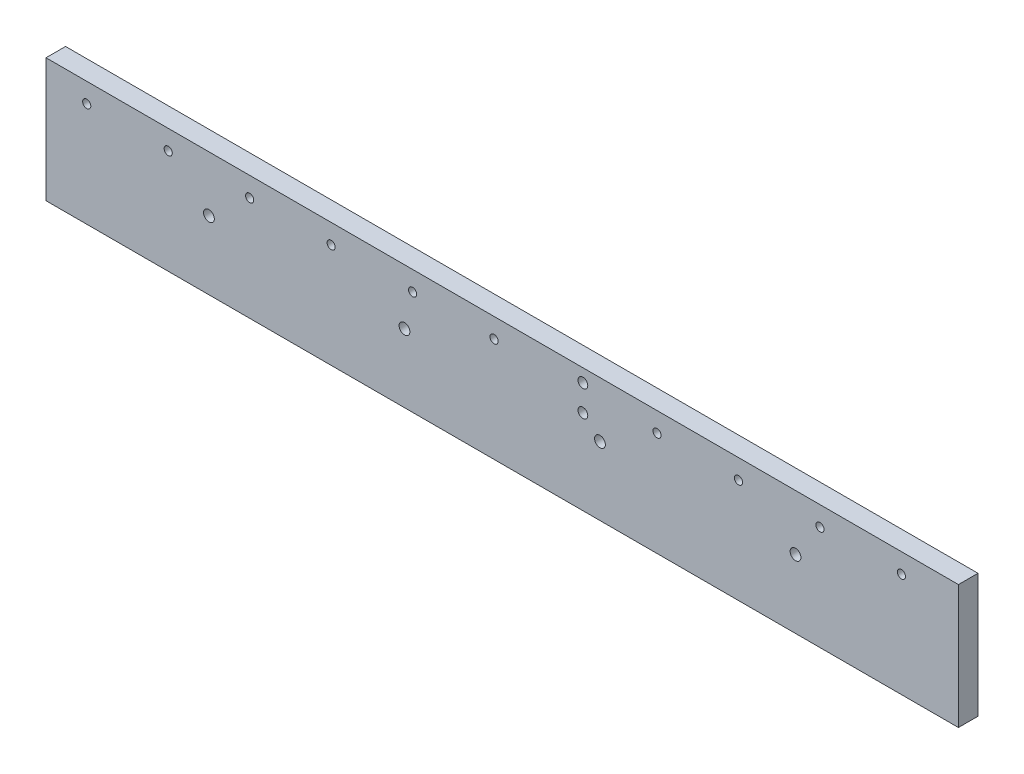
ISO-10303-21;
HEADER;
FILE_DESCRIPTION(('STEP AP214'),'2;1');
FILE_NAME('part.step','',(''),(''),'','','');
FILE_SCHEMA(('AUTOMOTIVE_DESIGN { 1 0 10303 214 1 1 1 1 }'));
ENDSEC;
DATA;
#1=APPLICATION_CONTEXT('core data for automotive mechanical design processes');
#2=APPLICATION_PROTOCOL_DEFINITION('international standard','automotive_design',2000,#1);
#3=PRODUCT_CONTEXT('',#1,'mechanical');
#4=PRODUCT('Part','Part','',(#3));
#5=PRODUCT_RELATED_PRODUCT_CATEGORY('part','',(#4));
#6=PRODUCT_DEFINITION_FORMATION('','',#4);
#7=PRODUCT_DEFINITION_CONTEXT('part definition',#1,'design');
#8=PRODUCT_DEFINITION('design','',#6,#7);
#9=PRODUCT_DEFINITION_SHAPE('','',#8);
#10=(LENGTH_UNIT() NAMED_UNIT(*) SI_UNIT(.MILLI.,.METRE.));
#11=(NAMED_UNIT(*) PLANE_ANGLE_UNIT() SI_UNIT($,.RADIAN.));
#12=(NAMED_UNIT(*) SI_UNIT($,.STERADIAN.) SOLID_ANGLE_UNIT());
#13=UNCERTAINTY_MEASURE_WITH_UNIT(LENGTH_MEASURE(1.E-05),#10,'distance_accuracy_value','');
#14=(GEOMETRIC_REPRESENTATION_CONTEXT(3) GLOBAL_UNCERTAINTY_ASSIGNED_CONTEXT((#13)) GLOBAL_UNIT_ASSIGNED_CONTEXT((#10,
#11,#12)) REPRESENTATION_CONTEXT('',''));
#15=CARTESIAN_POINT('',(0.,0.,0.));
#16=DIRECTION('',(0.,0.,1.));
#17=DIRECTION('',(1.,0.,0.));
#18=AXIS2_PLACEMENT_3D('',#15,#16,#17);
#19=CARTESIAN_POINT('',(0.,0.,6.));
#20=DIRECTION('',(1.,0.,0.));
#21=DIRECTION('',(0.,0.,-1.));
#22=AXIS2_PLACEMENT_3D('',#19,#20,#21);
#23=PLANE('',#22);
#24=DIRECTION('',(0.,-1.,0.));
#25=VECTOR('',#24,1.);
#26=CARTESIAN_POINT('',(0.,0.,0.));
#27=LINE('',#26,#25);
#28=CARTESIAN_POINT('',(0.,38.,0.));
#29=VERTEX_POINT('',#28);
#30=CARTESIAN_POINT('',(0.,0.,0.));
#31=VERTEX_POINT('',#30);
#32=EDGE_CURVE('E95',#29,#31,#27,.T.);
#33=ORIENTED_EDGE('',*,*,#32,.T.);
#34=DIRECTION('',(0.,0.,-1.));
#35=VECTOR('',#34,1.);
#36=CARTESIAN_POINT('',(0.,0.,6.));
#37=LINE('',#36,#35);
#38=CARTESIAN_POINT('',(0.,0.,6.));
#39=VERTEX_POINT('',#38);
#40=EDGE_CURVE('E11',#39,#31,#37,.T.);
#41=ORIENTED_EDGE('',*,*,#40,.F.);
#42=DIRECTION('',(0.,-1.,0.));
#43=VECTOR('',#42,1.);
#44=CARTESIAN_POINT('',(0.,0.,6.));
#45=LINE('',#44,#43);
#46=CARTESIAN_POINT('',(0.,38.,6.));
#47=VERTEX_POINT('',#46);
#48=EDGE_CURVE('E83',#47,#39,#45,.T.);
#49=ORIENTED_EDGE('',*,*,#48,.F.);
#50=DIRECTION('',(0.,0.,-1.));
#51=VECTOR('',#50,1.);
#52=CARTESIAN_POINT('',(0.,38.,6.));
#53=LINE('',#52,#51);
#54=EDGE_CURVE('E91',#47,#29,#53,.T.);
#55=ORIENTED_EDGE('',*,*,#54,.T.);
#56=EDGE_LOOP('',(#33,#41,#49,#55));
#57=FACE_BOUND('',#56,.T.);
#58=ADVANCED_FACE('F32',(#57),#23,.F.);
#59=CARTESIAN_POINT('',(0.,0.,6.));
#60=DIRECTION('',(0.,1.,0.));
#61=DIRECTION('',(0.,0.,1.));
#62=AXIS2_PLACEMENT_3D('',#59,#60,#61);
#63=PLANE('',#62);
#64=DIRECTION('',(1.,0.,0.));
#65=VECTOR('',#64,1.);
#66=CARTESIAN_POINT('',(0.,0.,0.));
#67=LINE('',#66,#65);
#68=CARTESIAN_POINT('',(280.,0.,0.));
#69=VERTEX_POINT('',#68);
#70=EDGE_CURVE('E87',#31,#69,#67,.T.);
#71=ORIENTED_EDGE('',*,*,#70,.T.);
#72=DIRECTION('',(0.,0.,-1.));
#73=VECTOR('',#72,1.);
#74=CARTESIAN_POINT('',(280.,0.,6.));
#75=LINE('',#74,#73);
#76=CARTESIAN_POINT('',(280.,0.,6.));
#77=VERTEX_POINT('',#76);
#78=EDGE_CURVE('E40',#77,#69,#75,.T.);
#79=ORIENTED_EDGE('',*,*,#78,.F.);
#80=DIRECTION('',(1.,0.,0.));
#81=VECTOR('',#80,1.);
#82=CARTESIAN_POINT('',(0.,0.,6.));
#83=LINE('',#82,#81);
#84=EDGE_CURVE('E78',#39,#77,#83,.T.);
#85=ORIENTED_EDGE('',*,*,#84,.F.);
#86=ORIENTED_EDGE('',*,*,#40,.T.);
#87=EDGE_LOOP('',(#71,#79,#85,#86));
#88=FACE_BOUND('',#87,.T.);
#89=ADVANCED_FACE('F86',(#88),#63,.F.);
#90=CARTESIAN_POINT('',(280.,0.,6.));
#91=DIRECTION('',(-1.,0.,0.));
#92=DIRECTION('',(0.,0.,1.));
#93=AXIS2_PLACEMENT_3D('',#90,#91,#92);
#94=PLANE('',#93);
#95=DIRECTION('',(0.,1.,0.));
#96=VECTOR('',#95,1.);
#97=CARTESIAN_POINT('',(280.,0.,0.));
#98=LINE('',#97,#96);
#99=CARTESIAN_POINT('',(280.,38.,0.));
#100=VERTEX_POINT('',#99);
#101=EDGE_CURVE('E65',#69,#100,#98,.T.);
#102=ORIENTED_EDGE('',*,*,#101,.T.);
#103=DIRECTION('',(0.,0.,-1.));
#104=VECTOR('',#103,1.);
#105=CARTESIAN_POINT('',(280.,38.,6.));
#106=LINE('',#105,#104);
#107=CARTESIAN_POINT('',(280.,38.,6.));
#108=VERTEX_POINT('',#107);
#109=EDGE_CURVE('E88',#108,#100,#106,.T.);
#110=ORIENTED_EDGE('',*,*,#109,.F.);
#111=DIRECTION('',(0.,1.,0.));
#112=VECTOR('',#111,1.);
#113=CARTESIAN_POINT('',(280.,0.,6.));
#114=LINE('',#113,#112);
#115=EDGE_CURVE('E81',#77,#108,#114,.T.);
#116=ORIENTED_EDGE('',*,*,#115,.F.);
#117=ORIENTED_EDGE('',*,*,#78,.T.);
#118=EDGE_LOOP('',(#102,#110,#116,#117));
#119=FACE_BOUND('',#118,.T.);
#120=ADVANCED_FACE('F89',(#119),#94,.F.);
#121=CARTESIAN_POINT('',(0.,38.,6.));
#122=DIRECTION('',(0.,-1.,0.));
#123=DIRECTION('',(0.,0.,-1.));
#124=AXIS2_PLACEMENT_3D('',#121,#122,#123);
#125=PLANE('',#124);
#126=DIRECTION('',(-1.,0.,0.));
#127=VECTOR('',#126,1.);
#128=CARTESIAN_POINT('',(0.,38.,0.));
#129=LINE('',#128,#127);
#130=EDGE_CURVE('E71',#100,#29,#129,.T.);
#131=ORIENTED_EDGE('',*,*,#130,.T.);
#132=ORIENTED_EDGE('',*,*,#54,.F.);
#133=DIRECTION('',(-1.,0.,0.));
#134=VECTOR('',#133,1.);
#135=CARTESIAN_POINT('',(0.,38.,6.));
#136=LINE('',#135,#134);
#137=EDGE_CURVE('E48',#108,#47,#136,.T.);
#138=ORIENTED_EDGE('',*,*,#137,.F.);
#139=ORIENTED_EDGE('',*,*,#109,.T.);
#140=EDGE_LOOP('',(#131,#132,#138,#139));
#141=FACE_BOUND('',#140,.T.);
#142=ADVANCED_FACE('F103',(#141),#125,.F.);
#143=CARTESIAN_POINT('',(0.,0.,6.));
#144=DIRECTION('',(0.,0.,-1.));
#145=DIRECTION('',(-1.,0.,0.));
#146=AXIS2_PLACEMENT_3D('',#143,#144,#145);
#147=PLANE('',#146);
#148=CARTESIAN_POINT('',(164.75,26.,6.));
#149=DIRECTION('',(0.,0.,-1.));
#150=DIRECTION('',(-1.,0.,0.));
#151=AXIS2_PLACEMENT_3D('',#148,#149,#150);
#152=CIRCLE('',#151,1.5);
#153=CARTESIAN_POINT('',(163.25,26.,6.));
#154=VERTEX_POINT('',#153);
#155=EDGE_CURVE('E198',#154,#154,#152,.T.);
#156=ORIENTED_EDGE('',*,*,#155,.T.);
#157=EDGE_LOOP('',(#156));
#158=FACE_BOUND('',#157,.T.);
#159=CARTESIAN_POINT('',(164.75,34.,6.));
#160=DIRECTION('',(0.,0.,-1.));
#161=DIRECTION('',(-1.,0.,0.));
#162=AXIS2_PLACEMENT_3D('',#159,#160,#161);
#163=CIRCLE('',#162,1.5);
#164=CARTESIAN_POINT('',(163.25,34.,6.));
#165=VERTEX_POINT('',#164);
#166=EDGE_CURVE('E188',#165,#165,#163,.T.);
#167=ORIENTED_EDGE('',*,*,#166,.T.);
#168=EDGE_LOOP('',(#167));
#169=FACE_BOUND('',#168,.T.);
#170=CARTESIAN_POINT('',(110.,21.,6.));
#171=DIRECTION('',(0.,0.,-1.));
#172=DIRECTION('',(-1.,0.,0.));
#173=AXIS2_PLACEMENT_3D('',#170,#171,#172);
#174=CIRCLE('',#173,1.65);
#175=CARTESIAN_POINT('',(108.35,21.,6.));
#176=VERTEX_POINT('',#175);
#177=EDGE_CURVE('E174',#176,#176,#174,.T.);
#178=ORIENTED_EDGE('',*,*,#177,.T.);
#179=EDGE_LOOP('',(#178));
#180=FACE_BOUND('',#179,.T.);
#181=CARTESIAN_POINT('',(170.,21.,6.));
#182=DIRECTION('',(0.,0.,-1.));
#183=DIRECTION('',(-1.,0.,0.));
#184=AXIS2_PLACEMENT_3D('',#181,#182,#183);
#185=CIRCLE('',#184,1.65000000000002);
#186=CARTESIAN_POINT('',(168.35,21.,6.));
#187=VERTEX_POINT('',#186);
#188=EDGE_CURVE('E177',#187,#187,#185,.T.);
#189=ORIENTED_EDGE('',*,*,#188,.T.);
#190=EDGE_LOOP('',(#189));
#191=FACE_BOUND('',#190,.T.);
#192=CARTESIAN_POINT('',(230.,21.,6.));
#193=DIRECTION('',(0.,0.,-1.));
#194=DIRECTION('',(-1.,0.,0.));
#195=AXIS2_PLACEMENT_3D('',#192,#193,#194);
#196=CIRCLE('',#195,1.65000000000002);
#197=CARTESIAN_POINT('',(228.35,21.,6.));
#198=VERTEX_POINT('',#197);
#199=EDGE_CURVE('E180',#198,#198,#196,.T.);
#200=ORIENTED_EDGE('',*,*,#199,.T.);
#201=EDGE_LOOP('',(#200));
#202=FACE_BOUND('',#201,.T.);
#203=CARTESIAN_POINT('',(50.,21.,6.));
#204=DIRECTION('',(0.,0.,-1.));
#205=DIRECTION('',(-1.,0.,0.));
#206=AXIS2_PLACEMENT_3D('',#203,#204,#205);
#207=CIRCLE('',#206,1.65);
#208=CARTESIAN_POINT('',(48.35,21.,6.));
#209=VERTEX_POINT('',#208);
#210=EDGE_CURVE('E119',#209,#209,#207,.T.);
#211=ORIENTED_EDGE('',*,*,#210,.T.);
#212=EDGE_LOOP('',(#211));
#213=FACE_BOUND('',#212,.T.);
#214=CARTESIAN_POINT('',(37.5,32.,6.));
#215=DIRECTION('',(0.,0.,1.));
#216=DIRECTION('',(1.,0.,0.));
#217=AXIS2_PLACEMENT_3D('',#214,#215,#216);
#218=CIRCLE('',#217,1.25);
#219=CARTESIAN_POINT('',(38.75,32.,6.));
#220=VERTEX_POINT('',#219);
#221=EDGE_CURVE('E164',#220,#220,#218,.T.);
#222=ORIENTED_EDGE('',*,*,#221,.F.);
#223=EDGE_LOOP('',(#222));
#224=FACE_BOUND('',#223,.T.);
#225=CARTESIAN_POINT('',(62.5,32.,6.));
#226=DIRECTION('',(0.,0.,1.));
#227=DIRECTION('',(1.,0.,0.));
#228=AXIS2_PLACEMENT_3D('',#225,#226,#227);
#229=CIRCLE('',#228,1.25000000000001);
#230=CARTESIAN_POINT('',(63.75,32.,6.));
#231=VERTEX_POINT('',#230);
#232=EDGE_CURVE('E158',#231,#231,#229,.T.);
#233=ORIENTED_EDGE('',*,*,#232,.F.);
#234=EDGE_LOOP('',(#233));
#235=FACE_BOUND('',#234,.T.);
#236=CARTESIAN_POINT('',(87.5,32.,6.));
#237=DIRECTION('',(0.,0.,1.));
#238=DIRECTION('',(1.,0.,0.));
#239=AXIS2_PLACEMENT_3D('',#236,#237,#238);
#240=CIRCLE('',#239,1.25);
#241=CARTESIAN_POINT('',(88.75,32.,6.));
#242=VERTEX_POINT('',#241);
#243=EDGE_CURVE('E152',#242,#242,#240,.T.);
#244=ORIENTED_EDGE('',*,*,#243,.F.);
#245=EDGE_LOOP('',(#244));
#246=FACE_BOUND('',#245,.T.);
#247=CARTESIAN_POINT('',(112.5,32.,6.));
#248=DIRECTION('',(0.,0.,1.));
#249=DIRECTION('',(1.,0.,0.));
#250=AXIS2_PLACEMENT_3D('',#247,#248,#249);
#251=CIRCLE('',#250,1.25);
#252=CARTESIAN_POINT('',(113.75,32.,6.));
#253=VERTEX_POINT('',#252);
#254=EDGE_CURVE('E146',#253,#253,#251,.T.);
#255=ORIENTED_EDGE('',*,*,#254,.F.);
#256=EDGE_LOOP('',(#255));
#257=FACE_BOUND('',#256,.T.);
#258=CARTESIAN_POINT('',(137.5,32.,6.));
#259=DIRECTION('',(0.,0.,1.));
#260=DIRECTION('',(1.,0.,0.));
#261=AXIS2_PLACEMENT_3D('',#258,#259,#260);
#262=CIRCLE('',#261,1.24999999999998);
#263=CARTESIAN_POINT('',(138.75,32.,6.));
#264=VERTEX_POINT('',#263);
#265=EDGE_CURVE('E140',#264,#264,#262,.T.);
#266=ORIENTED_EDGE('',*,*,#265,.F.);
#267=EDGE_LOOP('',(#266));
#268=FACE_BOUND('',#267,.T.);
#269=CARTESIAN_POINT('',(187.5,32.,6.));
#270=DIRECTION('',(0.,0.,1.));
#271=DIRECTION('',(1.,0.,0.));
#272=AXIS2_PLACEMENT_3D('',#269,#270,#271);
#273=CIRCLE('',#272,1.24999999999998);
#274=CARTESIAN_POINT('',(188.75,32.,6.));
#275=VERTEX_POINT('',#274);
#276=EDGE_CURVE('E134',#275,#275,#273,.T.);
#277=ORIENTED_EDGE('',*,*,#276,.F.);
#278=EDGE_LOOP('',(#277));
#279=FACE_BOUND('',#278,.T.);
#280=CARTESIAN_POINT('',(212.5,32.,6.));
#281=DIRECTION('',(0.,0.,1.));
#282=DIRECTION('',(1.,0.,0.));
#283=AXIS2_PLACEMENT_3D('',#280,#281,#282);
#284=CIRCLE('',#283,1.24999999999998);
#285=CARTESIAN_POINT('',(213.75,32.,6.));
#286=VERTEX_POINT('',#285);
#287=EDGE_CURVE('E128',#286,#286,#284,.T.);
#288=ORIENTED_EDGE('',*,*,#287,.F.);
#289=EDGE_LOOP('',(#288));
#290=FACE_BOUND('',#289,.T.);
#291=CARTESIAN_POINT('',(237.5,32.,6.));
#292=DIRECTION('',(0.,0.,1.));
#293=DIRECTION('',(1.,0.,0.));
#294=AXIS2_PLACEMENT_3D('',#291,#292,#293);
#295=CIRCLE('',#294,1.24999999999998);
#296=CARTESIAN_POINT('',(238.75,32.,6.));
#297=VERTEX_POINT('',#296);
#298=EDGE_CURVE('E122',#297,#297,#295,.T.);
#299=ORIENTED_EDGE('',*,*,#298,.F.);
#300=EDGE_LOOP('',(#299));
#301=FACE_BOUND('',#300,.T.);
#302=CARTESIAN_POINT('',(262.5,32.,6.));
#303=DIRECTION('',(0.,0.,1.));
#304=DIRECTION('',(1.,0.,0.));
#305=AXIS2_PLACEMENT_3D('',#302,#303,#304);
#306=CIRCLE('',#305,1.25000000000001);
#307=CARTESIAN_POINT('',(263.75,32.,6.));
#308=VERTEX_POINT('',#307);
#309=EDGE_CURVE('E115',#308,#308,#306,.T.);
#310=ORIENTED_EDGE('',*,*,#309,.F.);
#311=EDGE_LOOP('',(#310));
#312=FACE_BOUND('',#311,.T.);
#313=CARTESIAN_POINT('',(12.5,32.,6.));
#314=DIRECTION('',(0.,0.,1.));
#315=DIRECTION('',(1.,0.,0.));
#316=AXIS2_PLACEMENT_3D('',#313,#314,#315);
#317=CIRCLE('',#316,1.25);
#318=CARTESIAN_POINT('',(13.75,32.,6.));
#319=VERTEX_POINT('',#318);
#320=EDGE_CURVE('E109',#319,#319,#317,.T.);
#321=ORIENTED_EDGE('',*,*,#320,.F.);
#322=EDGE_LOOP('',(#321));
#323=FACE_BOUND('',#322,.T.);
#324=ORIENTED_EDGE('',*,*,#48,.T.);
#325=ORIENTED_EDGE('',*,*,#84,.T.);
#326=ORIENTED_EDGE('',*,*,#115,.T.);
#327=ORIENTED_EDGE('',*,*,#137,.T.);
#328=EDGE_LOOP('',(#324,#325,#326,#327));
#329=FACE_BOUND('',#328,.T.);
#330=ADVANCED_FACE('F79',(#158,#169,#180,#191,#202,#213,#224,#235,#246,#257,#268,#279,#290,#301,
#312,#323,#329),#147,.F.);
#331=CARTESIAN_POINT('',(0.,0.,0.));
#332=DIRECTION('',(0.,0.,-1.));
#333=DIRECTION('',(-1.,0.,0.));
#334=AXIS2_PLACEMENT_3D('',#331,#332,#333);
#335=PLANE('',#334);
#336=CARTESIAN_POINT('',(164.75,26.,0.));
#337=DIRECTION('',(0.,0.,1.));
#338=DIRECTION('',(1.,0.,0.));
#339=AXIS2_PLACEMENT_3D('',#336,#337,#338);
#340=CIRCLE('',#339,1.5);
#341=CARTESIAN_POINT('',(166.25,26.,0.));
#342=VERTEX_POINT('',#341);
#343=EDGE_CURVE('E201',#342,#342,#340,.T.);
#344=ORIENTED_EDGE('',*,*,#343,.T.);
#345=EDGE_LOOP('',(#344));
#346=FACE_BOUND('',#345,.T.);
#347=CARTESIAN_POINT('',(164.75,34.,0.));
#348=DIRECTION('',(0.,0.,1.));
#349=DIRECTION('',(1.,0.,0.));
#350=AXIS2_PLACEMENT_3D('',#347,#348,#349);
#351=CIRCLE('',#350,1.5);
#352=CARTESIAN_POINT('',(166.25,34.,0.));
#353=VERTEX_POINT('',#352);
#354=EDGE_CURVE('E195',#353,#353,#351,.T.);
#355=ORIENTED_EDGE('',*,*,#354,.T.);
#356=EDGE_LOOP('',(#355));
#357=FACE_BOUND('',#356,.T.);
#358=CARTESIAN_POINT('',(110.,21.,0.));
#359=DIRECTION('',(0.,0.,1.));
#360=DIRECTION('',(1.,0.,0.));
#361=AXIS2_PLACEMENT_3D('',#358,#359,#360);
#362=CIRCLE('',#361,1.65);
#363=CARTESIAN_POINT('',(111.65,21.,0.));
#364=VERTEX_POINT('',#363);
#365=EDGE_CURVE('E183',#364,#364,#362,.T.);
#366=ORIENTED_EDGE('',*,*,#365,.T.);
#367=EDGE_LOOP('',(#366));
#368=FACE_BOUND('',#367,.T.);
#369=CARTESIAN_POINT('',(170.,21.,0.));
#370=DIRECTION('',(0.,0.,1.));
#371=DIRECTION('',(1.,0.,0.));
#372=AXIS2_PLACEMENT_3D('',#369,#370,#371);
#373=CIRCLE('',#372,1.65000000000002);
#374=CARTESIAN_POINT('',(171.65,21.,0.));
#375=VERTEX_POINT('',#374);
#376=EDGE_CURVE('E187',#375,#375,#373,.T.);
#377=ORIENTED_EDGE('',*,*,#376,.T.);
#378=EDGE_LOOP('',(#377));
#379=FACE_BOUND('',#378,.T.);
#380=CARTESIAN_POINT('',(230.,21.,0.));
#381=DIRECTION('',(0.,0.,1.));
#382=DIRECTION('',(1.,0.,0.));
#383=AXIS2_PLACEMENT_3D('',#380,#381,#382);
#384=CIRCLE('',#383,1.65000000000002);
#385=CARTESIAN_POINT('',(231.65,21.,0.));
#386=VERTEX_POINT('',#385);
#387=EDGE_CURVE('E184',#386,#386,#384,.T.);
#388=ORIENTED_EDGE('',*,*,#387,.T.);
#389=EDGE_LOOP('',(#388));
#390=FACE_BOUND('',#389,.T.);
#391=CARTESIAN_POINT('',(50.,21.,0.));
#392=DIRECTION('',(0.,0.,1.));
#393=DIRECTION('',(1.,0.,0.));
#394=AXIS2_PLACEMENT_3D('',#391,#392,#393);
#395=CIRCLE('',#394,1.65);
#396=CARTESIAN_POINT('',(51.65,21.,0.));
#397=VERTEX_POINT('',#396);
#398=EDGE_CURVE('E171',#397,#397,#395,.T.);
#399=ORIENTED_EDGE('',*,*,#398,.T.);
#400=EDGE_LOOP('',(#399));
#401=FACE_BOUND('',#400,.T.);
#402=CARTESIAN_POINT('',(37.5,32.,0.));
#403=DIRECTION('',(0.,0.,1.));
#404=DIRECTION('',(1.,0.,0.));
#405=AXIS2_PLACEMENT_3D('',#402,#403,#404);
#406=CIRCLE('',#405,1.25);
#407=CARTESIAN_POINT('',(38.75,32.,0.));
#408=VERTEX_POINT('',#407);
#409=EDGE_CURVE('E112',#408,#408,#406,.T.);
#410=ORIENTED_EDGE('',*,*,#409,.T.);
#411=EDGE_LOOP('',(#410));
#412=FACE_BOUND('',#411,.T.);
#413=CARTESIAN_POINT('',(62.5,32.,0.));
#414=DIRECTION('',(0.,0.,1.));
#415=DIRECTION('',(1.,0.,0.));
#416=AXIS2_PLACEMENT_3D('',#413,#414,#415);
#417=CIRCLE('',#416,1.25000000000001);
#418=CARTESIAN_POINT('',(63.75,32.,0.));
#419=VERTEX_POINT('',#418);
#420=EDGE_CURVE('E161',#419,#419,#417,.T.);
#421=ORIENTED_EDGE('',*,*,#420,.T.);
#422=EDGE_LOOP('',(#421));
#423=FACE_BOUND('',#422,.T.);
#424=CARTESIAN_POINT('',(87.5,32.,0.));
#425=DIRECTION('',(0.,0.,1.));
#426=DIRECTION('',(1.,0.,0.));
#427=AXIS2_PLACEMENT_3D('',#424,#425,#426);
#428=CIRCLE('',#427,1.25);
#429=CARTESIAN_POINT('',(88.75,32.,0.));
#430=VERTEX_POINT('',#429);
#431=EDGE_CURVE('E155',#430,#430,#428,.T.);
#432=ORIENTED_EDGE('',*,*,#431,.T.);
#433=EDGE_LOOP('',(#432));
#434=FACE_BOUND('',#433,.T.);
#435=CARTESIAN_POINT('',(112.5,32.,0.));
#436=DIRECTION('',(0.,0.,1.));
#437=DIRECTION('',(1.,0.,0.));
#438=AXIS2_PLACEMENT_3D('',#435,#436,#437);
#439=CIRCLE('',#438,1.25);
#440=CARTESIAN_POINT('',(113.75,32.,0.));
#441=VERTEX_POINT('',#440);
#442=EDGE_CURVE('E149',#441,#441,#439,.T.);
#443=ORIENTED_EDGE('',*,*,#442,.T.);
#444=EDGE_LOOP('',(#443));
#445=FACE_BOUND('',#444,.T.);
#446=CARTESIAN_POINT('',(137.5,32.,0.));
#447=DIRECTION('',(0.,0.,1.));
#448=DIRECTION('',(1.,0.,0.));
#449=AXIS2_PLACEMENT_3D('',#446,#447,#448);
#450=CIRCLE('',#449,1.24999999999998);
#451=CARTESIAN_POINT('',(138.75,32.,0.));
#452=VERTEX_POINT('',#451);
#453=EDGE_CURVE('E143',#452,#452,#450,.T.);
#454=ORIENTED_EDGE('',*,*,#453,.T.);
#455=EDGE_LOOP('',(#454));
#456=FACE_BOUND('',#455,.T.);
#457=CARTESIAN_POINT('',(187.5,32.,0.));
#458=DIRECTION('',(0.,0.,1.));
#459=DIRECTION('',(1.,0.,0.));
#460=AXIS2_PLACEMENT_3D('',#457,#458,#459);
#461=CIRCLE('',#460,1.24999999999998);
#462=CARTESIAN_POINT('',(188.75,32.,0.));
#463=VERTEX_POINT('',#462);
#464=EDGE_CURVE('E137',#463,#463,#461,.T.);
#465=ORIENTED_EDGE('',*,*,#464,.T.);
#466=EDGE_LOOP('',(#465));
#467=FACE_BOUND('',#466,.T.);
#468=CARTESIAN_POINT('',(212.5,32.,0.));
#469=DIRECTION('',(0.,0.,1.));
#470=DIRECTION('',(1.,0.,0.));
#471=AXIS2_PLACEMENT_3D('',#468,#469,#470);
#472=CIRCLE('',#471,1.24999999999998);
#473=CARTESIAN_POINT('',(213.75,32.,0.));
#474=VERTEX_POINT('',#473);
#475=EDGE_CURVE('E131',#474,#474,#472,.T.);
#476=ORIENTED_EDGE('',*,*,#475,.T.);
#477=EDGE_LOOP('',(#476));
#478=FACE_BOUND('',#477,.T.);
#479=CARTESIAN_POINT('',(237.5,32.,0.));
#480=DIRECTION('',(0.,0.,1.));
#481=DIRECTION('',(1.,0.,0.));
#482=AXIS2_PLACEMENT_3D('',#479,#480,#481);
#483=CIRCLE('',#482,1.24999999999998);
#484=CARTESIAN_POINT('',(238.75,32.,0.));
#485=VERTEX_POINT('',#484);
#486=EDGE_CURVE('E125',#485,#485,#483,.T.);
#487=ORIENTED_EDGE('',*,*,#486,.T.);
#488=EDGE_LOOP('',(#487));
#489=FACE_BOUND('',#488,.T.);
#490=CARTESIAN_POINT('',(262.5,32.,0.));
#491=DIRECTION('',(0.,0.,1.));
#492=DIRECTION('',(1.,0.,0.));
#493=AXIS2_PLACEMENT_3D('',#490,#491,#492);
#494=CIRCLE('',#493,1.25000000000001);
#495=CARTESIAN_POINT('',(263.75,32.,0.));
#496=VERTEX_POINT('',#495);
#497=EDGE_CURVE('E118',#496,#496,#494,.T.);
#498=ORIENTED_EDGE('',*,*,#497,.T.);
#499=EDGE_LOOP('',(#498));
#500=FACE_BOUND('',#499,.T.);
#501=CARTESIAN_POINT('',(12.5,32.,0.));
#502=DIRECTION('',(0.,0.,1.));
#503=DIRECTION('',(1.,0.,0.));
#504=AXIS2_PLACEMENT_3D('',#501,#502,#503);
#505=CIRCLE('',#504,1.25);
#506=CARTESIAN_POINT('',(13.75,32.,0.));
#507=VERTEX_POINT('',#506);
#508=EDGE_CURVE('E98',#507,#507,#505,.T.);
#509=ORIENTED_EDGE('',*,*,#508,.T.);
#510=EDGE_LOOP('',(#509));
#511=FACE_BOUND('',#510,.T.);
#512=ORIENTED_EDGE('',*,*,#32,.F.);
#513=ORIENTED_EDGE('',*,*,#130,.F.);
#514=ORIENTED_EDGE('',*,*,#101,.F.);
#515=ORIENTED_EDGE('',*,*,#70,.F.);
#516=EDGE_LOOP('',(#512,#513,#514,#515));
#517=FACE_BOUND('',#516,.T.);
#518=ADVANCED_FACE('F106',(#346,#357,#368,#379,#390,#401,#412,#423,#434,#445,#456,#467,#478,
#489,#500,#511,#517),#335,.T.);
#519=CARTESIAN_POINT('',(12.5,32.,0.));
#520=DIRECTION('',(0.,0.,1.));
#521=DIRECTION('',(1.,0.,0.));
#522=AXIS2_PLACEMENT_3D('',#519,#520,#521);
#523=CYLINDRICAL_SURFACE('',#522,1.25);
#524=ORIENTED_EDGE('',*,*,#508,.F.);
#525=EDGE_LOOP('',(#524));
#526=FACE_BOUND('',#525,.T.);
#527=ORIENTED_EDGE('',*,*,#320,.T.);
#528=EDGE_LOOP('',(#527));
#529=FACE_BOUND('',#528,.T.);
#530=ADVANCED_FACE('F247',(#526,#529),#523,.F.);
#531=CARTESIAN_POINT('',(262.5,32.,0.));
#532=DIRECTION('',(0.,0.,1.));
#533=DIRECTION('',(1.,0.,0.));
#534=AXIS2_PLACEMENT_3D('',#531,#532,#533);
#535=CYLINDRICAL_SURFACE('',#534,1.25000000000001);
#536=ORIENTED_EDGE('',*,*,#497,.F.);
#537=EDGE_LOOP('',(#536));
#538=FACE_BOUND('',#537,.T.);
#539=ORIENTED_EDGE('',*,*,#309,.T.);
#540=EDGE_LOOP('',(#539));
#541=FACE_BOUND('',#540,.T.);
#542=ADVANCED_FACE('F249',(#538,#541),#535,.F.);
#543=CARTESIAN_POINT('',(237.5,32.,0.));
#544=DIRECTION('',(0.,0.,1.));
#545=DIRECTION('',(1.,0.,0.));
#546=AXIS2_PLACEMENT_3D('',#543,#544,#545);
#547=CYLINDRICAL_SURFACE('',#546,1.24999999999998);
#548=ORIENTED_EDGE('',*,*,#486,.F.);
#549=EDGE_LOOP('',(#548));
#550=FACE_BOUND('',#549,.T.);
#551=ORIENTED_EDGE('',*,*,#298,.T.);
#552=EDGE_LOOP('',(#551));
#553=FACE_BOUND('',#552,.T.);
#554=ADVANCED_FACE('F256',(#550,#553),#547,.F.);
#555=CARTESIAN_POINT('',(212.5,32.,0.));
#556=DIRECTION('',(0.,0.,1.));
#557=DIRECTION('',(1.,0.,0.));
#558=AXIS2_PLACEMENT_3D('',#555,#556,#557);
#559=CYLINDRICAL_SURFACE('',#558,1.24999999999998);
#560=ORIENTED_EDGE('',*,*,#475,.F.);
#561=EDGE_LOOP('',(#560));
#562=FACE_BOUND('',#561,.T.);
#563=ORIENTED_EDGE('',*,*,#287,.T.);
#564=EDGE_LOOP('',(#563));
#565=FACE_BOUND('',#564,.T.);
#566=ADVANCED_FACE('F380',(#562,#565),#559,.F.);
#567=CARTESIAN_POINT('',(187.5,32.,0.));
#568=DIRECTION('',(0.,0.,1.));
#569=DIRECTION('',(1.,0.,0.));
#570=AXIS2_PLACEMENT_3D('',#567,#568,#569);
#571=CYLINDRICAL_SURFACE('',#570,1.24999999999998);
#572=ORIENTED_EDGE('',*,*,#464,.F.);
#573=EDGE_LOOP('',(#572));
#574=FACE_BOUND('',#573,.T.);
#575=ORIENTED_EDGE('',*,*,#276,.T.);
#576=EDGE_LOOP('',(#575));
#577=FACE_BOUND('',#576,.T.);
#578=ADVANCED_FACE('F372',(#574,#577),#571,.F.);
#579=CARTESIAN_POINT('',(137.5,32.,0.));
#580=DIRECTION('',(0.,0.,1.));
#581=DIRECTION('',(1.,0.,0.));
#582=AXIS2_PLACEMENT_3D('',#579,#580,#581);
#583=CYLINDRICAL_SURFACE('',#582,1.24999999999998);
#584=ORIENTED_EDGE('',*,*,#453,.F.);
#585=EDGE_LOOP('',(#584));
#586=FACE_BOUND('',#585,.T.);
#587=ORIENTED_EDGE('',*,*,#265,.T.);
#588=EDGE_LOOP('',(#587));
#589=FACE_BOUND('',#588,.T.);
#590=ADVANCED_FACE('F364',(#586,#589),#583,.F.);
#591=CARTESIAN_POINT('',(112.5,32.,0.));
#592=DIRECTION('',(0.,0.,1.));
#593=DIRECTION('',(1.,0.,0.));
#594=AXIS2_PLACEMENT_3D('',#591,#592,#593);
#595=CYLINDRICAL_SURFACE('',#594,1.25);
#596=ORIENTED_EDGE('',*,*,#442,.F.);
#597=EDGE_LOOP('',(#596));
#598=FACE_BOUND('',#597,.T.);
#599=ORIENTED_EDGE('',*,*,#254,.T.);
#600=EDGE_LOOP('',(#599));
#601=FACE_BOUND('',#600,.T.);
#602=ADVANCED_FACE('F356',(#598,#601),#595,.F.);
#603=CARTESIAN_POINT('',(87.5,32.,0.));
#604=DIRECTION('',(0.,0.,1.));
#605=DIRECTION('',(1.,0.,0.));
#606=AXIS2_PLACEMENT_3D('',#603,#604,#605);
#607=CYLINDRICAL_SURFACE('',#606,1.25);
#608=ORIENTED_EDGE('',*,*,#431,.F.);
#609=EDGE_LOOP('',(#608));
#610=FACE_BOUND('',#609,.T.);
#611=ORIENTED_EDGE('',*,*,#243,.T.);
#612=EDGE_LOOP('',(#611));
#613=FACE_BOUND('',#612,.T.);
#614=ADVANCED_FACE('F348',(#610,#613),#607,.F.);
#615=CARTESIAN_POINT('',(62.5,32.,0.));
#616=DIRECTION('',(0.,0.,1.));
#617=DIRECTION('',(1.,0.,0.));
#618=AXIS2_PLACEMENT_3D('',#615,#616,#617);
#619=CYLINDRICAL_SURFACE('',#618,1.25000000000001);
#620=ORIENTED_EDGE('',*,*,#420,.F.);
#621=EDGE_LOOP('',(#620));
#622=FACE_BOUND('',#621,.T.);
#623=ORIENTED_EDGE('',*,*,#232,.T.);
#624=EDGE_LOOP('',(#623));
#625=FACE_BOUND('',#624,.T.);
#626=ADVANCED_FACE('F340',(#622,#625),#619,.F.);
#627=CARTESIAN_POINT('',(37.5,32.,0.));
#628=DIRECTION('',(0.,0.,1.));
#629=DIRECTION('',(1.,0.,0.));
#630=AXIS2_PLACEMENT_3D('',#627,#628,#629);
#631=CYLINDRICAL_SURFACE('',#630,1.25);
#632=ORIENTED_EDGE('',*,*,#409,.F.);
#633=EDGE_LOOP('',(#632));
#634=FACE_BOUND('',#633,.T.);
#635=ORIENTED_EDGE('',*,*,#221,.T.);
#636=EDGE_LOOP('',(#635));
#637=FACE_BOUND('',#636,.T.);
#638=ADVANCED_FACE('F333',(#634,#637),#631,.F.);
#639=CARTESIAN_POINT('',(50.,21.,0.));
#640=DIRECTION('',(0.,0.,1.));
#641=DIRECTION('',(1.,0.,0.));
#642=AXIS2_PLACEMENT_3D('',#639,#640,#641);
#643=CYLINDRICAL_SURFACE('',#642,1.65);
#644=ORIENTED_EDGE('',*,*,#398,.F.);
#645=EDGE_LOOP('',(#644));
#646=FACE_BOUND('',#645,.T.);
#647=ORIENTED_EDGE('',*,*,#210,.F.);
#648=EDGE_LOOP('',(#647));
#649=FACE_BOUND('',#648,.T.);
#650=ADVANCED_FACE('F325',(#646,#649),#643,.F.);
#651=CARTESIAN_POINT('',(230.,21.,0.));
#652=DIRECTION('',(0.,0.,1.));
#653=DIRECTION('',(1.,0.,0.));
#654=AXIS2_PLACEMENT_3D('',#651,#652,#653);
#655=CYLINDRICAL_SURFACE('',#654,1.65000000000002);
#656=ORIENTED_EDGE('',*,*,#387,.F.);
#657=EDGE_LOOP('',(#656));
#658=FACE_BOUND('',#657,.T.);
#659=ORIENTED_EDGE('',*,*,#199,.F.);
#660=EDGE_LOOP('',(#659));
#661=FACE_BOUND('',#660,.T.);
#662=ADVANCED_FACE('F317',(#658,#661),#655,.F.);
#663=CARTESIAN_POINT('',(170.,21.,0.));
#664=DIRECTION('',(0.,0.,1.));
#665=DIRECTION('',(1.,0.,0.));
#666=AXIS2_PLACEMENT_3D('',#663,#664,#665);
#667=CYLINDRICAL_SURFACE('',#666,1.65000000000002);
#668=ORIENTED_EDGE('',*,*,#376,.F.);
#669=EDGE_LOOP('',(#668));
#670=FACE_BOUND('',#669,.T.);
#671=ORIENTED_EDGE('',*,*,#188,.F.);
#672=EDGE_LOOP('',(#671));
#673=FACE_BOUND('',#672,.T.);
#674=ADVANCED_FACE('F310',(#670,#673),#667,.F.);
#675=CARTESIAN_POINT('',(110.,21.,0.));
#676=DIRECTION('',(0.,0.,1.));
#677=DIRECTION('',(1.,0.,0.));
#678=AXIS2_PLACEMENT_3D('',#675,#676,#677);
#679=CYLINDRICAL_SURFACE('',#678,1.65);
#680=ORIENTED_EDGE('',*,*,#365,.F.);
#681=EDGE_LOOP('',(#680));
#682=FACE_BOUND('',#681,.T.);
#683=ORIENTED_EDGE('',*,*,#177,.F.);
#684=EDGE_LOOP('',(#683));
#685=FACE_BOUND('',#684,.T.);
#686=ADVANCED_FACE('F295',(#682,#685),#679,.F.);
#687=CARTESIAN_POINT('',(164.75,34.,0.));
#688=DIRECTION('',(0.,0.,1.));
#689=DIRECTION('',(1.,0.,0.));
#690=AXIS2_PLACEMENT_3D('',#687,#688,#689);
#691=CYLINDRICAL_SURFACE('',#690,1.5);
#692=ORIENTED_EDGE('',*,*,#354,.F.);
#693=EDGE_LOOP('',(#692));
#694=FACE_BOUND('',#693,.T.);
#695=ORIENTED_EDGE('',*,*,#166,.F.);
#696=EDGE_LOOP('',(#695));
#697=FACE_BOUND('',#696,.T.);
#698=ADVANCED_FACE('F210',(#694,#697),#691,.F.);
#699=CARTESIAN_POINT('',(164.75,26.,0.));
#700=DIRECTION('',(0.,0.,1.));
#701=DIRECTION('',(1.,0.,0.));
#702=AXIS2_PLACEMENT_3D('',#699,#700,#701);
#703=CYLINDRICAL_SURFACE('',#702,1.5);
#704=ORIENTED_EDGE('',*,*,#343,.F.);
#705=EDGE_LOOP('',(#704));
#706=FACE_BOUND('',#705,.T.);
#707=ORIENTED_EDGE('',*,*,#155,.F.);
#708=EDGE_LOOP('',(#707));
#709=FACE_BOUND('',#708,.T.);
#710=ADVANCED_FACE('F207',(#706,#709),#703,.F.);
#711=CLOSED_SHELL('',(#58,#89,#120,#142,#330,#518,#530,#542,#554,#566,#578,#590,#602,#614,#626,
#638,#650,#662,#674,#686,#698,#710));
#712=MANIFOLD_SOLID_BREP('B2',#711);
#713=ADVANCED_BREP_SHAPE_REPRESENTATION('',(#18,#712),#14);
#714=SHAPE_DEFINITION_REPRESENTATION(#9,#713);
ENDSEC;
END-ISO-10303-21;
